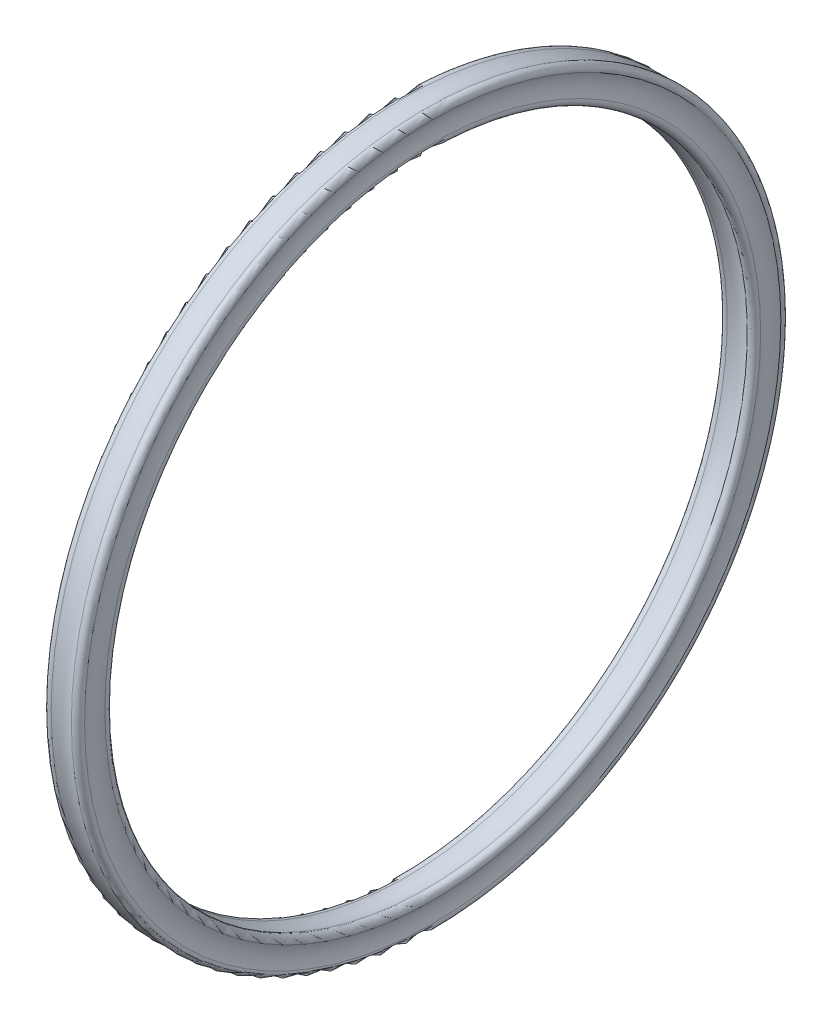
ISO-10303-21;
HEADER;
FILE_DESCRIPTION(('STEP AP214'),'2;1');
FILE_NAME('part.step','',(''),(''),'','','');
FILE_SCHEMA(('AUTOMOTIVE_DESIGN { 1 0 10303 214 1 1 1 1 }'));
ENDSEC;
DATA;
#1=APPLICATION_CONTEXT('core data for automotive mechanical design processes');
#2=APPLICATION_PROTOCOL_DEFINITION('international standard','automotive_design',2000,#1);
#3=PRODUCT_CONTEXT('',#1,'mechanical');
#4=PRODUCT('Part','Part','',(#3));
#5=PRODUCT_RELATED_PRODUCT_CATEGORY('part','',(#4));
#6=PRODUCT_DEFINITION_FORMATION('','',#4);
#7=PRODUCT_DEFINITION_CONTEXT('part definition',#1,'design');
#8=PRODUCT_DEFINITION('design','',#6,#7);
#9=PRODUCT_DEFINITION_SHAPE('','',#8);
#10=(LENGTH_UNIT() NAMED_UNIT(*) SI_UNIT(.MILLI.,.METRE.));
#11=(NAMED_UNIT(*) PLANE_ANGLE_UNIT() SI_UNIT($,.RADIAN.));
#12=(NAMED_UNIT(*) SI_UNIT($,.STERADIAN.) SOLID_ANGLE_UNIT());
#13=UNCERTAINTY_MEASURE_WITH_UNIT(LENGTH_MEASURE(1.E-05),#10,'distance_accuracy_value','');
#14=(GEOMETRIC_REPRESENTATION_CONTEXT(3) GLOBAL_UNCERTAINTY_ASSIGNED_CONTEXT((#13)) GLOBAL_UNIT_ASSIGNED_CONTEXT((#10,
#11,#12)) REPRESENTATION_CONTEXT('',''));
#15=CARTESIAN_POINT('',(0.,0.,0.));
#16=DIRECTION('',(0.,0.,1.));
#17=DIRECTION('',(1.,0.,0.));
#18=AXIS2_PLACEMENT_3D('',#15,#16,#17);
#19=CARTESIAN_POINT('',(-0.924966380470123,0.,0.));
#20=DIRECTION('',(-1.,0.,0.));
#21=DIRECTION('',(0.,0.,1.));
#22=AXIS2_PLACEMENT_3D('',#19,#20,#21);
#23=TOROIDAL_SURFACE('',#22,26.6805663804701,0.383133619529878);
#24=CARTESIAN_POINT('',(-1.27510284616489,0.,0.));
#25=DIRECTION('',(-1.,0.,0.));
#26=DIRECTION('',(0.,0.,1.));
#27=AXIS2_PLACEMENT_3D('',#24,#25,#26);
#28=CIRCLE('',#27,26.525016305559);
#29=CARTESIAN_POINT('',(-1.27510284616489,0.,26.525016305559));
#30=VERTEX_POINT('',#29);
#31=EDGE_CURVE('E58',#30,#30,#28,.T.);
#32=ORIENTED_EDGE('',*,*,#31,.F.);
#33=EDGE_LOOP('',(#32));
#34=FACE_BOUND('',#33,.T.);
#35=CARTESIAN_POINT('',(-0.769416305559048,0.,0.));
#36=DIRECTION('',(-1.,0.,0.));
#37=DIRECTION('',(0.,0.,1.));
#38=AXIS2_PLACEMENT_3D('',#35,#36,#37);
#39=CIRCLE('',#38,27.0307028461649);
#40=CARTESIAN_POINT('',(-0.769416305559048,0.,27.0307028461649));
#41=VERTEX_POINT('',#40);
#42=EDGE_CURVE('E10',#41,#41,#39,.T.);
#43=ORIENTED_EDGE('',*,*,#42,.T.);
#44=EDGE_LOOP('',(#43));
#45=FACE_BOUND('',#44,.T.);
#46=ADVANCED_FACE('F30',(#34,#45),#23,.T.);
#47=CARTESIAN_POINT('',(0.,0.,0.));
#48=DIRECTION('',(-1.,0.,0.));
#49=DIRECTION('',(0.,0.,1.));
#50=AXIS2_PLACEMENT_3D('',#47,#48,#49);
#51=TOROIDAL_SURFACE('',#50,28.7626255471368,1.8951405471368);
#52=ORIENTED_EDGE('',*,*,#42,.F.);
#53=EDGE_LOOP('',(#52));
#54=FACE_BOUND('',#53,.T.);
#55=CARTESIAN_POINT('',(0.769416305559048,0.,0.));
#56=DIRECTION('',(-1.,0.,0.));
#57=DIRECTION('',(0.,0.,1.));
#58=AXIS2_PLACEMENT_3D('',#55,#56,#57);
#59=CIRCLE('',#58,27.0307028461649);
#60=CARTESIAN_POINT('',(0.769416305559048,0.,27.0307028461649));
#61=VERTEX_POINT('',#60);
#62=EDGE_CURVE('E36',#61,#61,#59,.T.);
#63=ORIENTED_EDGE('',*,*,#62,.T.);
#64=EDGE_LOOP('',(#63));
#65=FACE_BOUND('',#64,.T.);
#66=ADVANCED_FACE('F65',(#54,#65),#51,.F.);
#67=CARTESIAN_POINT('',(0.924966380470123,0.,0.));
#68=DIRECTION('',(-1.,0.,0.));
#69=DIRECTION('',(0.,0.,1.));
#70=AXIS2_PLACEMENT_3D('',#67,#68,#69);
#71=TOROIDAL_SURFACE('',#70,26.6805663804701,0.383133619529877);
#72=ORIENTED_EDGE('',*,*,#62,.F.);
#73=EDGE_LOOP('',(#72));
#74=FACE_BOUND('',#73,.T.);
#75=CARTESIAN_POINT('',(1.27510284616489,0.,0.));
#76=DIRECTION('',(-1.,0.,0.));
#77=DIRECTION('',(0.,0.,1.));
#78=AXIS2_PLACEMENT_3D('',#75,#76,#77);
#79=CIRCLE('',#78,26.525016305559);
#80=CARTESIAN_POINT('',(1.27510284616489,0.,26.525016305559));
#81=VERTEX_POINT('',#80);
#82=EDGE_CURVE('E40',#81,#81,#79,.T.);
#83=ORIENTED_EDGE('',*,*,#82,.T.);
#84=EDGE_LOOP('',(#83));
#85=FACE_BOUND('',#84,.T.);
#86=ADVANCED_FACE('F69',(#74,#85),#71,.T.);
#87=CARTESIAN_POINT('',(3.0070255471368,0.,0.));
#88=DIRECTION('',(-1.,0.,0.));
#89=DIRECTION('',(0.,0.,1.));
#90=AXIS2_PLACEMENT_3D('',#87,#88,#89);
#91=TOROIDAL_SURFACE('',#90,25.7556,1.8951405471368);
#92=ORIENTED_EDGE('',*,*,#82,.F.);
#93=EDGE_LOOP('',(#92));
#94=FACE_BOUND('',#93,.T.);
#95=CARTESIAN_POINT('',(1.27510284616489,0.,0.));
#96=DIRECTION('',(-1.,0.,0.));
#97=DIRECTION('',(0.,0.,1.));
#98=AXIS2_PLACEMENT_3D('',#95,#96,#97);
#99=CIRCLE('',#98,24.986183694441);
#100=CARTESIAN_POINT('',(1.27510284616489,0.,24.986183694441));
#101=VERTEX_POINT('',#100);
#102=EDGE_CURVE('E44',#101,#101,#99,.T.);
#103=ORIENTED_EDGE('',*,*,#102,.T.);
#104=EDGE_LOOP('',(#103));
#105=FACE_BOUND('',#104,.T.);
#106=ADVANCED_FACE('F74',(#94,#105),#91,.F.);
#107=CARTESIAN_POINT('',(0.924966380470129,0.,0.));
#108=DIRECTION('',(-1.,0.,0.));
#109=DIRECTION('',(0.,0.,1.));
#110=AXIS2_PLACEMENT_3D('',#107,#108,#109);
#111=TOROIDAL_SURFACE('',#110,24.8306336195299,0.383133619529868);
#112=ORIENTED_EDGE('',*,*,#102,.F.);
#113=EDGE_LOOP('',(#112));
#114=FACE_BOUND('',#113,.T.);
#115=CARTESIAN_POINT('',(0.769416305559056,0.,0.));
#116=DIRECTION('',(-1.,0.,0.));
#117=DIRECTION('',(0.,0.,1.));
#118=AXIS2_PLACEMENT_3D('',#115,#116,#117);
#119=CIRCLE('',#118,24.4804971538351);
#120=CARTESIAN_POINT('',(0.769416305559056,0.,24.4804971538351));
#121=VERTEX_POINT('',#120);
#122=EDGE_CURVE('E49',#121,#121,#119,.T.);
#123=ORIENTED_EDGE('',*,*,#122,.T.);
#124=EDGE_LOOP('',(#123));
#125=FACE_BOUND('',#124,.T.);
#126=ADVANCED_FACE('F80',(#114,#125),#111,.T.);
#127=CARTESIAN_POINT('',(0.,0.,0.));
#128=DIRECTION('',(-1.,0.,0.));
#129=DIRECTION('',(0.,0.,1.));
#130=AXIS2_PLACEMENT_3D('',#127,#128,#129);
#131=TOROIDAL_SURFACE('',#130,22.7485744528632,1.8951405471368);
#132=ORIENTED_EDGE('',*,*,#122,.F.);
#133=EDGE_LOOP('',(#132));
#134=FACE_BOUND('',#133,.T.);
#135=CARTESIAN_POINT('',(-0.769416305559057,0.,0.));
#136=DIRECTION('',(-1.,0.,0.));
#137=DIRECTION('',(0.,0.,1.));
#138=AXIS2_PLACEMENT_3D('',#135,#136,#137);
#139=CIRCLE('',#138,24.4804971538351);
#140=CARTESIAN_POINT('',(-0.769416305559057,0.,24.4804971538351));
#141=VERTEX_POINT('',#140);
#142=EDGE_CURVE('E52',#141,#141,#139,.T.);
#143=ORIENTED_EDGE('',*,*,#142,.T.);
#144=EDGE_LOOP('',(#143));
#145=FACE_BOUND('',#144,.T.);
#146=ADVANCED_FACE('F84',(#134,#145),#131,.F.);
#147=CARTESIAN_POINT('',(-0.924966380470131,0.,0.));
#148=DIRECTION('',(-1.,0.,0.));
#149=DIRECTION('',(0.,0.,1.));
#150=AXIS2_PLACEMENT_3D('',#147,#148,#149);
#151=TOROIDAL_SURFACE('',#150,24.8306336195299,0.383133619529868);
#152=ORIENTED_EDGE('',*,*,#142,.F.);
#153=EDGE_LOOP('',(#152));
#154=FACE_BOUND('',#153,.T.);
#155=CARTESIAN_POINT('',(-1.27510284616489,0.,0.));
#156=DIRECTION('',(-1.,0.,0.));
#157=DIRECTION('',(0.,0.,1.));
#158=AXIS2_PLACEMENT_3D('',#155,#156,#157);
#159=CIRCLE('',#158,24.986183694441);
#160=CARTESIAN_POINT('',(-1.27510284616489,0.,24.986183694441));
#161=VERTEX_POINT('',#160);
#162=EDGE_CURVE('E55',#161,#161,#159,.T.);
#163=ORIENTED_EDGE('',*,*,#162,.T.);
#164=EDGE_LOOP('',(#163));
#165=FACE_BOUND('',#164,.T.);
#166=ADVANCED_FACE('F88',(#154,#165),#151,.T.);
#167=CARTESIAN_POINT('',(-3.0070255471368,0.,0.));
#168=DIRECTION('',(-1.,0.,0.));
#169=DIRECTION('',(0.,0.,1.));
#170=AXIS2_PLACEMENT_3D('',#167,#168,#169);
#171=TOROIDAL_SURFACE('',#170,25.7556,1.8951405471368);
#172=ORIENTED_EDGE('',*,*,#162,.F.);
#173=EDGE_LOOP('',(#172));
#174=FACE_BOUND('',#173,.T.);
#175=ORIENTED_EDGE('',*,*,#31,.T.);
#176=EDGE_LOOP('',(#175));
#177=FACE_BOUND('',#176,.T.);
#178=ADVANCED_FACE('F62',(#174,#177),#171,.F.);
#179=CLOSED_SHELL('',(#46,#66,#86,#106,#126,#146,#166,#178));
#180=MANIFOLD_SOLID_BREP('B2',#179);
#181=ADVANCED_BREP_SHAPE_REPRESENTATION('',(#18,#180),#14);
#182=SHAPE_DEFINITION_REPRESENTATION(#9,#181);
ENDSEC;
END-ISO-10303-21;
